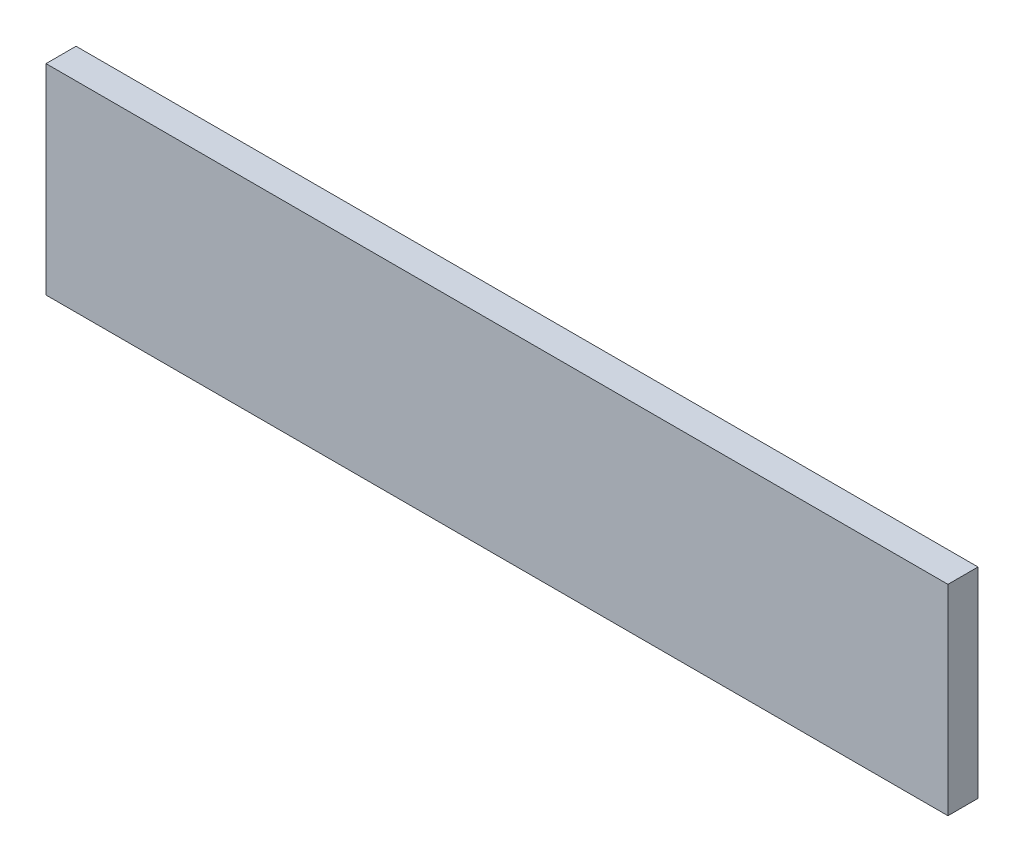
ISO-10303-21;
HEADER;
FILE_DESCRIPTION(('STEP AP214'),'2;1');
FILE_NAME('part.step','',(''),(''),'','','');
FILE_SCHEMA(('AUTOMOTIVE_DESIGN { 1 0 10303 214 1 1 1 1 }'));
ENDSEC;
DATA;
#1=APPLICATION_CONTEXT('core data for automotive mechanical design processes');
#2=APPLICATION_PROTOCOL_DEFINITION('international standard','automotive_design',2000,#1);
#3=PRODUCT_CONTEXT('',#1,'mechanical');
#4=PRODUCT('Part','Part','',(#3));
#5=PRODUCT_RELATED_PRODUCT_CATEGORY('part','',(#4));
#6=PRODUCT_DEFINITION_FORMATION('','',#4);
#7=PRODUCT_DEFINITION_CONTEXT('part definition',#1,'design');
#8=PRODUCT_DEFINITION('design','',#6,#7);
#9=PRODUCT_DEFINITION_SHAPE('','',#8);
#10=(LENGTH_UNIT() NAMED_UNIT(*) SI_UNIT(.MILLI.,.METRE.));
#11=(NAMED_UNIT(*) PLANE_ANGLE_UNIT() SI_UNIT($,.RADIAN.));
#12=(NAMED_UNIT(*) SI_UNIT($,.STERADIAN.) SOLID_ANGLE_UNIT());
#13=UNCERTAINTY_MEASURE_WITH_UNIT(LENGTH_MEASURE(1.E-05),#10,'distance_accuracy_value','');
#14=(GEOMETRIC_REPRESENTATION_CONTEXT(3) GLOBAL_UNCERTAINTY_ASSIGNED_CONTEXT((#13)) GLOBAL_UNIT_ASSIGNED_CONTEXT((#10,
#11,#12)) REPRESENTATION_CONTEXT('',''));
#15=CARTESIAN_POINT('',(0.,0.,0.));
#16=DIRECTION('',(0.,0.,1.));
#17=DIRECTION('',(1.,0.,0.));
#18=AXIS2_PLACEMENT_3D('',#15,#16,#17);
#19=CARTESIAN_POINT('',(22.5,-5.,1.5));
#20=DIRECTION('',(-1.,0.,0.));
#21=DIRECTION('',(0.,0.,1.));
#22=AXIS2_PLACEMENT_3D('',#19,#20,#21);
#23=PLANE('',#22);
#24=DIRECTION('',(0.,1.,0.));
#25=VECTOR('',#24,1.);
#26=CARTESIAN_POINT('',(22.5,-5.,0.));
#27=LINE('',#26,#25);
#28=CARTESIAN_POINT('',(22.5,-5.,0.));
#29=VERTEX_POINT('',#28);
#30=CARTESIAN_POINT('',(22.5,5.,0.));
#31=VERTEX_POINT('',#30);
#32=EDGE_CURVE('E96',#29,#31,#27,.T.);
#33=ORIENTED_EDGE('',*,*,#32,.T.);
#34=DIRECTION('',(0.,0.,-1.));
#35=VECTOR('',#34,1.);
#36=CARTESIAN_POINT('',(22.5,5.,1.5));
#37=LINE('',#36,#35);
#38=CARTESIAN_POINT('',(22.5,5.,1.5));
#39=VERTEX_POINT('',#38);
#40=EDGE_CURVE('E11',#39,#31,#37,.T.);
#41=ORIENTED_EDGE('',*,*,#40,.F.);
#42=DIRECTION('',(0.,1.,0.));
#43=VECTOR('',#42,1.);
#44=CARTESIAN_POINT('',(22.5,-5.,1.5));
#45=LINE('',#44,#43);
#46=CARTESIAN_POINT('',(22.5,-5.,1.5));
#47=VERTEX_POINT('',#46);
#48=EDGE_CURVE('E84',#47,#39,#45,.T.);
#49=ORIENTED_EDGE('',*,*,#48,.F.);
#50=DIRECTION('',(0.,0.,-1.));
#51=VECTOR('',#50,1.);
#52=CARTESIAN_POINT('',(22.5,-5.,1.5));
#53=LINE('',#52,#51);
#54=EDGE_CURVE('E92',#47,#29,#53,.T.);
#55=ORIENTED_EDGE('',*,*,#54,.T.);
#56=EDGE_LOOP('',(#33,#41,#49,#55));
#57=FACE_BOUND('',#56,.T.);
#58=ADVANCED_FACE('F33',(#57),#23,.F.);
#59=CARTESIAN_POINT('',(-22.5,5.,1.5));
#60=DIRECTION('',(0.,-1.,0.));
#61=DIRECTION('',(0.,0.,-1.));
#62=AXIS2_PLACEMENT_3D('',#59,#60,#61);
#63=PLANE('',#62);
#64=DIRECTION('',(-1.,0.,0.));
#65=VECTOR('',#64,1.);
#66=CARTESIAN_POINT('',(-22.5,5.,0.));
#67=LINE('',#66,#65);
#68=CARTESIAN_POINT('',(-22.5,5.,0.));
#69=VERTEX_POINT('',#68);
#70=EDGE_CURVE('E88',#31,#69,#67,.T.);
#71=ORIENTED_EDGE('',*,*,#70,.T.);
#72=DIRECTION('',(0.,0.,-1.));
#73=VECTOR('',#72,1.);
#74=CARTESIAN_POINT('',(-22.5,5.,1.5));
#75=LINE('',#74,#73);
#76=CARTESIAN_POINT('',(-22.5,5.,1.5));
#77=VERTEX_POINT('',#76);
#78=EDGE_CURVE('E41',#77,#69,#75,.T.);
#79=ORIENTED_EDGE('',*,*,#78,.F.);
#80=DIRECTION('',(-1.,0.,0.));
#81=VECTOR('',#80,1.);
#82=CARTESIAN_POINT('',(-22.5,5.,1.5));
#83=LINE('',#82,#81);
#84=EDGE_CURVE('E79',#39,#77,#83,.T.);
#85=ORIENTED_EDGE('',*,*,#84,.F.);
#86=ORIENTED_EDGE('',*,*,#40,.T.);
#87=EDGE_LOOP('',(#71,#79,#85,#86));
#88=FACE_BOUND('',#87,.T.);
#89=ADVANCED_FACE('F87',(#88),#63,.F.);
#90=CARTESIAN_POINT('',(-22.5,-5.,1.5));
#91=DIRECTION('',(1.,0.,0.));
#92=DIRECTION('',(0.,0.,-1.));
#93=AXIS2_PLACEMENT_3D('',#90,#91,#92);
#94=PLANE('',#93);
#95=DIRECTION('',(0.,-1.,0.));
#96=VECTOR('',#95,1.);
#97=CARTESIAN_POINT('',(-22.5,-5.,0.));
#98=LINE('',#97,#96);
#99=CARTESIAN_POINT('',(-22.5,-5.,0.));
#100=VERTEX_POINT('',#99);
#101=EDGE_CURVE('E66',#69,#100,#98,.T.);
#102=ORIENTED_EDGE('',*,*,#101,.T.);
#103=DIRECTION('',(0.,0.,-1.));
#104=VECTOR('',#103,1.);
#105=CARTESIAN_POINT('',(-22.5,-5.,1.5));
#106=LINE('',#105,#104);
#107=CARTESIAN_POINT('',(-22.5,-5.,1.5));
#108=VERTEX_POINT('',#107);
#109=EDGE_CURVE('E89',#108,#100,#106,.T.);
#110=ORIENTED_EDGE('',*,*,#109,.F.);
#111=DIRECTION('',(0.,-1.,0.));
#112=VECTOR('',#111,1.);
#113=CARTESIAN_POINT('',(-22.5,-5.,1.5));
#114=LINE('',#113,#112);
#115=EDGE_CURVE('E82',#77,#108,#114,.T.);
#116=ORIENTED_EDGE('',*,*,#115,.F.);
#117=ORIENTED_EDGE('',*,*,#78,.T.);
#118=EDGE_LOOP('',(#102,#110,#116,#117));
#119=FACE_BOUND('',#118,.T.);
#120=ADVANCED_FACE('F90',(#119),#94,.F.);
#121=CARTESIAN_POINT('',(-22.5,-5.,1.5));
#122=DIRECTION('',(0.,1.,0.));
#123=DIRECTION('',(0.,0.,1.));
#124=AXIS2_PLACEMENT_3D('',#121,#122,#123);
#125=PLANE('',#124);
#126=DIRECTION('',(1.,0.,0.));
#127=VECTOR('',#126,1.);
#128=CARTESIAN_POINT('',(-22.5,-5.,0.));
#129=LINE('',#128,#127);
#130=EDGE_CURVE('E72',#100,#29,#129,.T.);
#131=ORIENTED_EDGE('',*,*,#130,.T.);
#132=ORIENTED_EDGE('',*,*,#54,.F.);
#133=DIRECTION('',(1.,0.,0.));
#134=VECTOR('',#133,1.);
#135=CARTESIAN_POINT('',(-22.5,-5.,1.5));
#136=LINE('',#135,#134);
#137=EDGE_CURVE('E49',#108,#47,#136,.T.);
#138=ORIENTED_EDGE('',*,*,#137,.F.);
#139=ORIENTED_EDGE('',*,*,#109,.T.);
#140=EDGE_LOOP('',(#131,#132,#138,#139));
#141=FACE_BOUND('',#140,.T.);
#142=ADVANCED_FACE('F103',(#141),#125,.F.);
#143=CARTESIAN_POINT('',(22.5,5.,1.5));
#144=DIRECTION('',(0.,0.,-1.));
#145=DIRECTION('',(-1.,0.,0.));
#146=AXIS2_PLACEMENT_3D('',#143,#144,#145);
#147=PLANE('',#146);
#148=ORIENTED_EDGE('',*,*,#48,.T.);
#149=ORIENTED_EDGE('',*,*,#84,.T.);
#150=ORIENTED_EDGE('',*,*,#115,.T.);
#151=ORIENTED_EDGE('',*,*,#137,.T.);
#152=EDGE_LOOP('',(#148,#149,#150,#151));
#153=FACE_BOUND('',#152,.T.);
#154=ADVANCED_FACE('F80',(#153),#147,.F.);
#155=CARTESIAN_POINT('',(22.5,5.,0.));
#156=DIRECTION('',(0.,0.,-1.));
#157=DIRECTION('',(-1.,0.,0.));
#158=AXIS2_PLACEMENT_3D('',#155,#156,#157);
#159=PLANE('',#158);
#160=ORIENTED_EDGE('',*,*,#32,.F.);
#161=ORIENTED_EDGE('',*,*,#130,.F.);
#162=ORIENTED_EDGE('',*,*,#101,.F.);
#163=ORIENTED_EDGE('',*,*,#70,.F.);
#164=EDGE_LOOP('',(#160,#161,#162,#163));
#165=FACE_BOUND('',#164,.T.);
#166=ADVANCED_FACE('F106',(#165),#159,.T.);
#167=CLOSED_SHELL('',(#58,#89,#120,#142,#154,#166));
#168=MANIFOLD_SOLID_BREP('B2',#167);
#169=ADVANCED_BREP_SHAPE_REPRESENTATION('',(#18,#168),#14);
#170=SHAPE_DEFINITION_REPRESENTATION(#9,#169);
ENDSEC;
END-ISO-10303-21;
